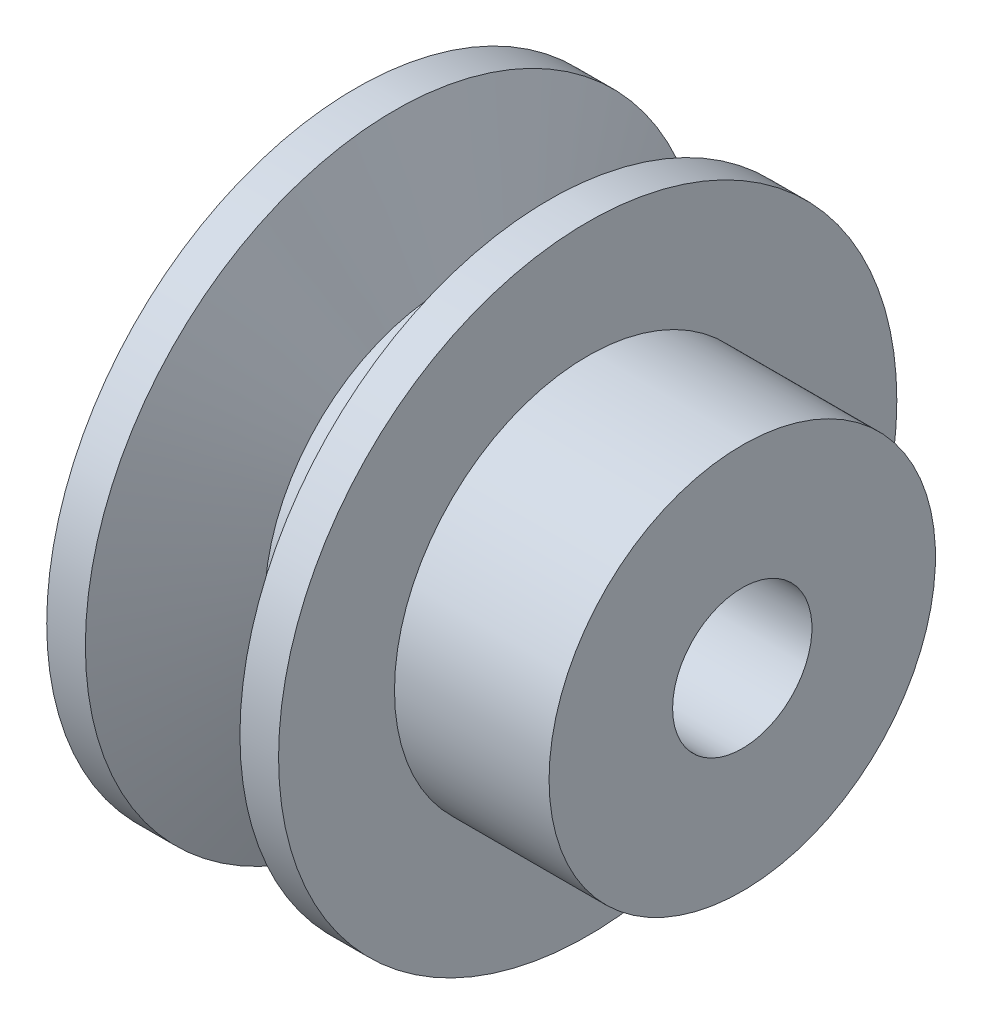
ISO-10303-21;
HEADER;
FILE_DESCRIPTION(('STEP AP214'),'2;1');
FILE_NAME('part.step','',(''),(''),'','','');
FILE_SCHEMA(('AUTOMOTIVE_DESIGN { 1 0 10303 214 1 1 1 1 }'));
ENDSEC;
DATA;
#1=APPLICATION_CONTEXT('core data for automotive mechanical design processes');
#2=APPLICATION_PROTOCOL_DEFINITION('international standard','automotive_design',2000,#1);
#3=PRODUCT_CONTEXT('',#1,'mechanical');
#4=PRODUCT('Part','Part','',(#3));
#5=PRODUCT_RELATED_PRODUCT_CATEGORY('part','',(#4));
#6=PRODUCT_DEFINITION_FORMATION('','',#4);
#7=PRODUCT_DEFINITION_CONTEXT('part definition',#1,'design');
#8=PRODUCT_DEFINITION('design','',#6,#7);
#9=PRODUCT_DEFINITION_SHAPE('','',#8);
#10=(LENGTH_UNIT() NAMED_UNIT(*) SI_UNIT(.MILLI.,.METRE.));
#11=(NAMED_UNIT(*) PLANE_ANGLE_UNIT() SI_UNIT($,.RADIAN.));
#12=(NAMED_UNIT(*) SI_UNIT($,.STERADIAN.) SOLID_ANGLE_UNIT());
#13=UNCERTAINTY_MEASURE_WITH_UNIT(LENGTH_MEASURE(1.E-05),#10,'distance_accuracy_value','');
#14=(GEOMETRIC_REPRESENTATION_CONTEXT(3) GLOBAL_UNCERTAINTY_ASSIGNED_CONTEXT((#13)) GLOBAL_UNIT_ASSIGNED_CONTEXT((#10,
#11,#12)) REPRESENTATION_CONTEXT('',''));
#15=CARTESIAN_POINT('',(0.,0.,0.));
#16=DIRECTION('',(0.,0.,1.));
#17=DIRECTION('',(1.,0.,0.));
#18=AXIS2_PLACEMENT_3D('',#15,#16,#17);
#19=CARTESIAN_POINT('',(16.2588232201148,9.01466890730631,0.));
#20=DIRECTION('',(-1.,0.,0.));
#21=DIRECTION('',(0.,0.,1.));
#22=AXIS2_PLACEMENT_3D('',#19,#20,#21);
#23=PLANE('',#22);
#24=CARTESIAN_POINT('',(16.2588232201148,0.,0.));
#25=DIRECTION('',(-1.,0.,0.));
#26=DIRECTION('',(0.,0.,1.));
#27=AXIS2_PLACEMENT_3D('',#24,#25,#26);
#28=CIRCLE('',#27,25.);
#29=CARTESIAN_POINT('',(16.2588232201148,0.,25.));
#30=VERTEX_POINT('',#29);
#31=EDGE_CURVE('E10',#30,#30,#28,.T.);
#32=ORIENTED_EDGE('',*,*,#31,.F.);
#33=EDGE_LOOP('',(#32));
#34=FACE_BOUND('',#33,.T.);
#35=CARTESIAN_POINT('',(16.2588232201148,0.,0.));
#36=DIRECTION('',(-1.,0.,0.));
#37=DIRECTION('',(0.,0.,1.));
#38=AXIS2_PLACEMENT_3D('',#35,#36,#37);
#39=CIRCLE('',#38,9.01466890730631);
#40=CARTESIAN_POINT('',(16.2588232201148,0.,9.01466890730631));
#41=VERTEX_POINT('',#40);
#42=EDGE_CURVE('E76',#41,#41,#39,.T.);
#43=ORIENTED_EDGE('',*,*,#42,.T.);
#44=EDGE_LOOP('',(#43));
#45=FACE_BOUND('',#44,.T.);
#46=ADVANCED_FACE('F39',(#34,#45),#23,.F.);
#47=CARTESIAN_POINT('',(-33.7411767798852,0.,0.));
#48=DIRECTION('',(-1.,0.,0.));
#49=DIRECTION('',(0.,0.,1.));
#50=AXIS2_PLACEMENT_3D('',#47,#48,#49);
#51=CYLINDRICAL_SURFACE('',#50,25.);
#52=CARTESIAN_POINT('',(-3.74117677988521,0.,0.));
#53=DIRECTION('',(-1.,0.,0.));
#54=DIRECTION('',(0.,0.,1.));
#55=AXIS2_PLACEMENT_3D('',#52,#53,#54);
#56=CIRCLE('',#55,25.);
#57=CARTESIAN_POINT('',(-3.74117677988521,0.,25.));
#58=VERTEX_POINT('',#57);
#59=EDGE_CURVE('E45',#58,#58,#56,.T.);
#60=ORIENTED_EDGE('',*,*,#59,.F.);
#61=EDGE_LOOP('',(#60));
#62=FACE_BOUND('',#61,.T.);
#63=ORIENTED_EDGE('',*,*,#31,.T.);
#64=EDGE_LOOP('',(#63));
#65=FACE_BOUND('',#64,.T.);
#66=ADVANCED_FACE('F131',(#62,#65),#51,.T.);
#67=CARTESIAN_POINT('',(-3.74117677988522,25.,0.));
#68=DIRECTION('',(-1.,0.,0.));
#69=DIRECTION('',(0.,0.,1.));
#70=AXIS2_PLACEMENT_3D('',#67,#68,#69);
#71=PLANE('',#70);
#72=CARTESIAN_POINT('',(-3.74117677988521,0.,0.));
#73=DIRECTION('',(-1.,0.,0.));
#74=DIRECTION('',(0.,0.,1.));
#75=AXIS2_PLACEMENT_3D('',#72,#73,#74);
#76=CIRCLE('',#75,40.);
#77=CARTESIAN_POINT('',(-3.74117677988521,0.,40.));
#78=VERTEX_POINT('',#77);
#79=EDGE_CURVE('E49',#78,#78,#76,.T.);
#80=ORIENTED_EDGE('',*,*,#79,.F.);
#81=EDGE_LOOP('',(#80));
#82=FACE_BOUND('',#81,.T.);
#83=ORIENTED_EDGE('',*,*,#59,.T.);
#84=EDGE_LOOP('',(#83));
#85=FACE_BOUND('',#84,.T.);
#86=ADVANCED_FACE('F126',(#82,#85),#71,.F.);
#87=CARTESIAN_POINT('',(-33.7411767798852,0.,0.));
#88=DIRECTION('',(-1.,0.,0.));
#89=DIRECTION('',(0.,0.,1.));
#90=AXIS2_PLACEMENT_3D('',#87,#88,#89);
#91=CYLINDRICAL_SURFACE('',#90,40.);
#92=CARTESIAN_POINT('',(-8.74117677988522,0.,0.));
#93=DIRECTION('',(-1.,0.,0.));
#94=DIRECTION('',(0.,0.,1.));
#95=AXIS2_PLACEMENT_3D('',#92,#93,#94);
#96=CIRCLE('',#95,40.);
#97=CARTESIAN_POINT('',(-8.74117677988522,0.,40.));
#98=VERTEX_POINT('',#97);
#99=EDGE_CURVE('E53',#98,#98,#96,.T.);
#100=ORIENTED_EDGE('',*,*,#99,.F.);
#101=EDGE_LOOP('',(#100));
#102=FACE_BOUND('',#101,.T.);
#103=ORIENTED_EDGE('',*,*,#79,.T.);
#104=EDGE_LOOP('',(#103));
#105=FACE_BOUND('',#104,.T.);
#106=ADVANCED_FACE('F120',(#102,#105),#91,.T.);
#107=CARTESIAN_POINT('',(-8.74117677988522,0.,0.));
#108=DIRECTION('',(1.,0.,0.));
#109=DIRECTION('',(0.,0.,-1.));
#110=AXIS2_PLACEMENT_3D('',#107,#108,#109);
#111=CONICAL_SURFACE('',#110,40.,1.17809724509618);
#112=CARTESIAN_POINT('',(-15.5362981560428,0.,0.));
#113=DIRECTION('',(-1.,0.,0.));
#114=DIRECTION('',(0.,0.,1.));
#115=AXIS2_PLACEMENT_3D('',#112,#113,#114);
#116=CIRCLE('',#115,23.5951258157086);
#117=CARTESIAN_POINT('',(-15.5362981560428,0.,23.5951258157086));
#118=VERTEX_POINT('',#117);
#119=EDGE_CURVE('E58',#118,#118,#116,.T.);
#120=ORIENTED_EDGE('',*,*,#119,.F.);
#121=EDGE_LOOP('',(#120));
#122=FACE_BOUND('',#121,.T.);
#123=ORIENTED_EDGE('',*,*,#99,.T.);
#124=EDGE_LOOP('',(#123));
#125=FACE_BOUND('',#124,.T.);
#126=ADVANCED_FACE('F114',(#122,#125),#111,.T.);
#127=CARTESIAN_POINT('',(-33.7411767798852,0.,0.));
#128=DIRECTION('',(-1.,0.,0.));
#129=DIRECTION('',(0.,0.,1.));
#130=AXIS2_PLACEMENT_3D('',#127,#128,#129);
#131=CYLINDRICAL_SURFACE('',#130,23.5951258157086);
#132=CARTESIAN_POINT('',(-21.9460554037275,0.,0.));
#133=DIRECTION('',(-1.,0.,0.));
#134=DIRECTION('',(0.,0.,1.));
#135=AXIS2_PLACEMENT_3D('',#132,#133,#134);
#136=CIRCLE('',#135,23.5951258157086);
#137=CARTESIAN_POINT('',(-21.9460554037275,0.,23.5951258157086));
#138=VERTEX_POINT('',#137);
#139=EDGE_CURVE('E61',#138,#138,#136,.T.);
#140=ORIENTED_EDGE('',*,*,#139,.F.);
#141=EDGE_LOOP('',(#140));
#142=FACE_BOUND('',#141,.T.);
#143=ORIENTED_EDGE('',*,*,#119,.T.);
#144=EDGE_LOOP('',(#143));
#145=FACE_BOUND('',#144,.T.);
#146=ADVANCED_FACE('F108',(#142,#145),#131,.T.);
#147=CARTESIAN_POINT('',(-21.9460554037275,0.,0.));
#148=DIRECTION('',(-1.,0.,0.));
#149=DIRECTION('',(0.,0.,1.));
#150=AXIS2_PLACEMENT_3D('',#147,#148,#149);
#151=CONICAL_SURFACE('',#150,23.5951258157086,1.17809724509617);
#152=CARTESIAN_POINT('',(-28.7411767798852,0.,0.));
#153=DIRECTION('',(-1.,0.,0.));
#154=DIRECTION('',(0.,0.,1.));
#155=AXIS2_PLACEMENT_3D('',#152,#153,#154);
#156=CIRCLE('',#155,40.);
#157=CARTESIAN_POINT('',(-28.7411767798852,0.,40.));
#158=VERTEX_POINT('',#157);
#159=EDGE_CURVE('E64',#158,#158,#156,.T.);
#160=ORIENTED_EDGE('',*,*,#159,.F.);
#161=EDGE_LOOP('',(#160));
#162=FACE_BOUND('',#161,.T.);
#163=ORIENTED_EDGE('',*,*,#139,.T.);
#164=EDGE_LOOP('',(#163));
#165=FACE_BOUND('',#164,.T.);
#166=ADVANCED_FACE('F102',(#162,#165),#151,.T.);
#167=CARTESIAN_POINT('',(-33.7411767798852,0.,0.));
#168=DIRECTION('',(-1.,0.,0.));
#169=DIRECTION('',(0.,0.,1.));
#170=AXIS2_PLACEMENT_3D('',#167,#168,#169);
#171=CYLINDRICAL_SURFACE('',#170,40.);
#172=CARTESIAN_POINT('',(-33.7411767798852,0.,0.));
#173=DIRECTION('',(-1.,0.,0.));
#174=DIRECTION('',(0.,0.,1.));
#175=AXIS2_PLACEMENT_3D('',#172,#173,#174);
#176=CIRCLE('',#175,40.);
#177=CARTESIAN_POINT('',(-33.7411767798852,0.,40.));
#178=VERTEX_POINT('',#177);
#179=EDGE_CURVE('E67',#178,#178,#176,.T.);
#180=ORIENTED_EDGE('',*,*,#179,.F.);
#181=EDGE_LOOP('',(#180));
#182=FACE_BOUND('',#181,.T.);
#183=ORIENTED_EDGE('',*,*,#159,.T.);
#184=EDGE_LOOP('',(#183));
#185=FACE_BOUND('',#184,.T.);
#186=ADVANCED_FACE('F96',(#182,#185),#171,.T.);
#187=CARTESIAN_POINT('',(-33.7411767798852,40.,0.));
#188=DIRECTION('',(1.,0.,0.));
#189=DIRECTION('',(0.,0.,-1.));
#190=AXIS2_PLACEMENT_3D('',#187,#188,#189);
#191=PLANE('',#190);
#192=CARTESIAN_POINT('',(-33.7411767798852,0.,0.));
#193=DIRECTION('',(-1.,0.,0.));
#194=DIRECTION('',(0.,0.,1.));
#195=AXIS2_PLACEMENT_3D('',#192,#193,#194);
#196=CIRCLE('',#195,20.);
#197=CARTESIAN_POINT('',(-33.7411767798852,0.,20.));
#198=VERTEX_POINT('',#197);
#199=EDGE_CURVE('E70',#198,#198,#196,.T.);
#200=ORIENTED_EDGE('',*,*,#199,.F.);
#201=EDGE_LOOP('',(#200));
#202=FACE_BOUND('',#201,.T.);
#203=ORIENTED_EDGE('',*,*,#179,.T.);
#204=EDGE_LOOP('',(#203));
#205=FACE_BOUND('',#204,.T.);
#206=ADVANCED_FACE('F90',(#202,#205),#191,.F.);
#207=CARTESIAN_POINT('',(-33.7411767798852,0.,0.));
#208=DIRECTION('',(-1.,0.,0.));
#209=DIRECTION('',(0.,0.,1.));
#210=AXIS2_PLACEMENT_3D('',#207,#208,#209);
#211=CONICAL_SURFACE('',#210,20.,1.14366591805298);
#212=CARTESIAN_POINT('',(-28.7411767798852,0.,0.));
#213=DIRECTION('',(-1.,0.,0.));
#214=DIRECTION('',(0.,0.,1.));
#215=AXIS2_PLACEMENT_3D('',#212,#213,#214);
#216=CIRCLE('',#215,9.01466890730631);
#217=CARTESIAN_POINT('',(-28.7411767798852,0.,9.01466890730631));
#218=VERTEX_POINT('',#217);
#219=EDGE_CURVE('E73',#218,#218,#216,.T.);
#220=ORIENTED_EDGE('',*,*,#219,.F.);
#221=EDGE_LOOP('',(#220));
#222=FACE_BOUND('',#221,.T.);
#223=ORIENTED_EDGE('',*,*,#199,.T.);
#224=EDGE_LOOP('',(#223));
#225=FACE_BOUND('',#224,.T.);
#226=ADVANCED_FACE('F84',(#222,#225),#211,.F.);
#227=CARTESIAN_POINT('',(-33.7411767798852,0.,0.));
#228=DIRECTION('',(-1.,0.,0.));
#229=DIRECTION('',(0.,0.,1.));
#230=AXIS2_PLACEMENT_3D('',#227,#228,#229);
#231=CYLINDRICAL_SURFACE('',#230,9.01466890730631);
#232=ORIENTED_EDGE('',*,*,#42,.F.);
#233=EDGE_LOOP('',(#232));
#234=FACE_BOUND('',#233,.T.);
#235=ORIENTED_EDGE('',*,*,#219,.T.);
#236=EDGE_LOOP('',(#235));
#237=FACE_BOUND('',#236,.T.);
#238=ADVANCED_FACE('F81',(#234,#237),#231,.F.);
#239=CLOSED_SHELL('',(#46,#66,#86,#106,#126,#146,#166,#186,#206,#226,#238));
#240=MANIFOLD_SOLID_BREP('B2',#239);
#241=ADVANCED_BREP_SHAPE_REPRESENTATION('',(#18,#240),#14);
#242=SHAPE_DEFINITION_REPRESENTATION(#9,#241);
ENDSEC;
END-ISO-10303-21;
